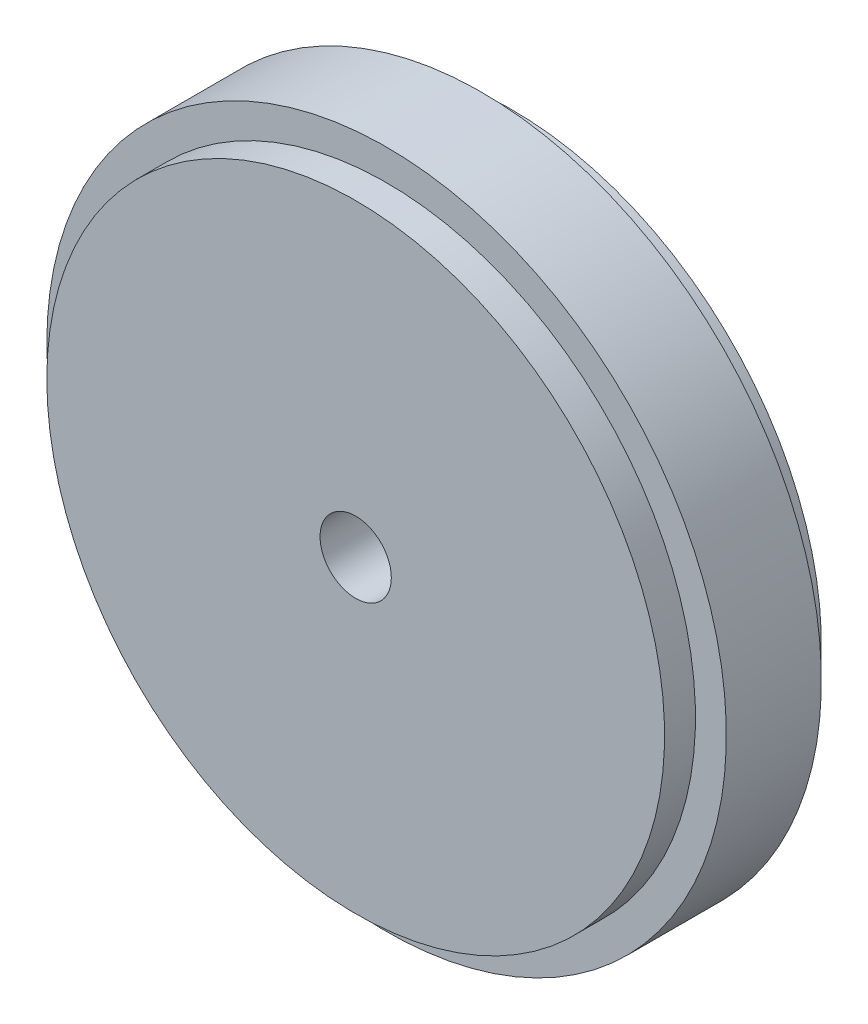
ISO-10303-21;
HEADER;
FILE_DESCRIPTION(('STEP AP214'),'2;1');
FILE_NAME('part.step','',(''),(''),'','','');
FILE_SCHEMA(('AUTOMOTIVE_DESIGN { 1 0 10303 214 1 1 1 1 }'));
ENDSEC;
DATA;
#1=APPLICATION_CONTEXT('core data for automotive mechanical design processes');
#2=APPLICATION_PROTOCOL_DEFINITION('international standard','automotive_design',2000,#1);
#3=PRODUCT_CONTEXT('',#1,'mechanical');
#4=PRODUCT('Part','Part','',(#3));
#5=PRODUCT_RELATED_PRODUCT_CATEGORY('part','',(#4));
#6=PRODUCT_DEFINITION_FORMATION('','',#4);
#7=PRODUCT_DEFINITION_CONTEXT('part definition',#1,'design');
#8=PRODUCT_DEFINITION('design','',#6,#7);
#9=PRODUCT_DEFINITION_SHAPE('','',#8);
#10=(LENGTH_UNIT() NAMED_UNIT(*) SI_UNIT(.MILLI.,.METRE.));
#11=(NAMED_UNIT(*) PLANE_ANGLE_UNIT() SI_UNIT($,.RADIAN.));
#12=(NAMED_UNIT(*) SI_UNIT($,.STERADIAN.) SOLID_ANGLE_UNIT());
#13=UNCERTAINTY_MEASURE_WITH_UNIT(LENGTH_MEASURE(1.E-05),#10,'distance_accuracy_value','');
#14=(GEOMETRIC_REPRESENTATION_CONTEXT(3) GLOBAL_UNCERTAINTY_ASSIGNED_CONTEXT((#13)) GLOBAL_UNIT_ASSIGNED_CONTEXT((#10,
#11,#12)) REPRESENTATION_CONTEXT('',''));
#15=CARTESIAN_POINT('',(0.,0.,0.));
#16=DIRECTION('',(0.,0.,1.));
#17=DIRECTION('',(1.,0.,0.));
#18=AXIS2_PLACEMENT_3D('',#15,#16,#17);
#19=CARTESIAN_POINT('',(0.,0.,-12.81771984393));
#20=DIRECTION('',(0.,0.,-1.));
#21=DIRECTION('',(-1.,0.,0.));
#22=AXIS2_PLACEMENT_3D('',#19,#20,#21);
#23=CYLINDRICAL_SURFACE('',#22,13.);
#24=CARTESIAN_POINT('',(0.,0.,-5.3));
#25=DIRECTION('',(0.,0.,-1.));
#26=DIRECTION('',(-1.,0.,0.));
#27=AXIS2_PLACEMENT_3D('',#24,#25,#26);
#28=CIRCLE('',#27,13.);
#29=CARTESIAN_POINT('',(-13.,0.,-5.3));
#30=VERTEX_POINT('',#29);
#31=EDGE_CURVE('E10',#30,#30,#28,.T.);
#32=ORIENTED_EDGE('',*,*,#31,.T.);
#33=EDGE_LOOP('',(#32));
#34=FACE_BOUND('',#33,.T.);
#35=CARTESIAN_POINT('',(0.,0.,-6.6));
#36=DIRECTION('',(0.,0.,-1.));
#37=DIRECTION('',(-1.,0.,0.));
#38=AXIS2_PLACEMENT_3D('',#35,#36,#37);
#39=CIRCLE('',#38,13.);
#40=CARTESIAN_POINT('',(-13.,0.,-6.6));
#41=VERTEX_POINT('',#40);
#42=EDGE_CURVE('E60',#41,#41,#39,.T.);
#43=ORIENTED_EDGE('',*,*,#42,.F.);
#44=EDGE_LOOP('',(#43));
#45=FACE_BOUND('',#44,.T.);
#46=ADVANCED_FACE('F32',(#34,#45),#23,.T.);
#47=CARTESIAN_POINT('',(0.,0.,-5.3));
#48=DIRECTION('',(0.,0.,-1.));
#49=DIRECTION('',(-1.,0.,0.));
#50=AXIS2_PLACEMENT_3D('',#47,#48,#49);
#51=PLANE('',#50);
#52=CARTESIAN_POINT('',(0.,0.,-5.3));
#53=DIRECTION('',(0.,0.,-1.));
#54=DIRECTION('',(-1.,0.,0.));
#55=AXIS2_PLACEMENT_3D('',#52,#53,#54);
#56=CIRCLE('',#55,14.3);
#57=CARTESIAN_POINT('',(-14.3,0.,-5.3));
#58=VERTEX_POINT('',#57);
#59=EDGE_CURVE('E38',#58,#58,#56,.T.);
#60=ORIENTED_EDGE('',*,*,#59,.T.);
#61=EDGE_LOOP('',(#60));
#62=FACE_BOUND('',#61,.T.);
#63=ORIENTED_EDGE('',*,*,#31,.F.);
#64=EDGE_LOOP('',(#63));
#65=FACE_BOUND('',#64,.T.);
#66=ADVANCED_FACE('F100',(#62,#65),#51,.T.);
#67=CARTESIAN_POINT('',(0.,0.,-12.81771984393));
#68=DIRECTION('',(0.,0.,-1.));
#69=DIRECTION('',(-1.,0.,0.));
#70=AXIS2_PLACEMENT_3D('',#67,#68,#69);
#71=CYLINDRICAL_SURFACE('',#70,14.3);
#72=ORIENTED_EDGE('',*,*,#59,.F.);
#73=EDGE_LOOP('',(#72));
#74=FACE_BOUND('',#73,.T.);
#75=CARTESIAN_POINT('',(0.,0.,-1.3));
#76=DIRECTION('',(0.,0.,-1.));
#77=DIRECTION('',(-1.,0.,0.));
#78=AXIS2_PLACEMENT_3D('',#75,#76,#77);
#79=CIRCLE('',#78,14.3);
#80=CARTESIAN_POINT('',(-14.3,0.,-1.3));
#81=VERTEX_POINT('',#80);
#82=EDGE_CURVE('E42',#81,#81,#79,.T.);
#83=ORIENTED_EDGE('',*,*,#82,.T.);
#84=EDGE_LOOP('',(#83));
#85=FACE_BOUND('',#84,.T.);
#86=ADVANCED_FACE('F94',(#74,#85),#71,.T.);
#87=CARTESIAN_POINT('',(0.,0.,-1.3));
#88=DIRECTION('',(0.,0.,-1.));
#89=DIRECTION('',(-1.,0.,0.));
#90=AXIS2_PLACEMENT_3D('',#87,#88,#89);
#91=PLANE('',#90);
#92=ORIENTED_EDGE('',*,*,#82,.F.);
#93=EDGE_LOOP('',(#92));
#94=FACE_BOUND('',#93,.T.);
#95=CARTESIAN_POINT('',(0.,0.,-1.3));
#96=DIRECTION('',(0.,0.,-1.));
#97=DIRECTION('',(-1.,0.,0.));
#98=AXIS2_PLACEMENT_3D('',#95,#96,#97);
#99=CIRCLE('',#98,13.);
#100=CARTESIAN_POINT('',(-13.,0.,-1.3));
#101=VERTEX_POINT('',#100);
#102=EDGE_CURVE('E46',#101,#101,#99,.T.);
#103=ORIENTED_EDGE('',*,*,#102,.T.);
#104=EDGE_LOOP('',(#103));
#105=FACE_BOUND('',#104,.T.);
#106=ADVANCED_FACE('F89',(#94,#105),#91,.F.);
#107=CARTESIAN_POINT('',(0.,0.,-12.81771984393));
#108=DIRECTION('',(0.,0.,-1.));
#109=DIRECTION('',(-1.,0.,0.));
#110=AXIS2_PLACEMENT_3D('',#107,#108,#109);
#111=CYLINDRICAL_SURFACE('',#110,13.);
#112=CARTESIAN_POINT('',(0.,0.,0.));
#113=DIRECTION('',(0.,0.,-1.));
#114=DIRECTION('',(-1.,0.,0.));
#115=AXIS2_PLACEMENT_3D('',#112,#113,#114);
#116=CIRCLE('',#115,13.);
#117=CARTESIAN_POINT('',(-13.,0.,0.));
#118=VERTEX_POINT('',#117);
#119=EDGE_CURVE('E51',#118,#118,#116,.T.);
#120=ORIENTED_EDGE('',*,*,#119,.T.);
#121=EDGE_LOOP('',(#120));
#122=FACE_BOUND('',#121,.T.);
#123=ORIENTED_EDGE('',*,*,#102,.F.);
#124=EDGE_LOOP('',(#123));
#125=FACE_BOUND('',#124,.T.);
#126=ADVANCED_FACE('F83',(#122,#125),#111,.T.);
#127=CARTESIAN_POINT('',(0.,0.,0.));
#128=DIRECTION('',(0.,0.,-1.));
#129=DIRECTION('',(-1.,0.,0.));
#130=AXIS2_PLACEMENT_3D('',#127,#128,#129);
#131=PLANE('',#130);
#132=CARTESIAN_POINT('',(0.,0.,0.));
#133=DIRECTION('',(0.,0.,1.));
#134=DIRECTION('',(1.,0.,0.));
#135=AXIS2_PLACEMENT_3D('',#132,#133,#134);
#136=CIRCLE('',#135,1.5);
#137=CARTESIAN_POINT('',(1.5,0.,0.));
#138=VERTEX_POINT('',#137);
#139=EDGE_CURVE('E64',#138,#138,#136,.T.);
#140=ORIENTED_EDGE('',*,*,#139,.F.);
#141=EDGE_LOOP('',(#140));
#142=FACE_BOUND('',#141,.T.);
#143=ORIENTED_EDGE('',*,*,#119,.F.);
#144=EDGE_LOOP('',(#143));
#145=FACE_BOUND('',#144,.T.);
#146=ADVANCED_FACE('F80',(#142,#145),#131,.F.);
#147=CARTESIAN_POINT('',(0.,0.,-8.6));
#148=DIRECTION('',(0.,0.,-1.));
#149=DIRECTION('',(-1.,0.,0.));
#150=AXIS2_PLACEMENT_3D('',#147,#148,#149);
#151=PLANE('',#150);
#152=CARTESIAN_POINT('',(0.,0.,-8.6));
#153=DIRECTION('',(0.,0.,1.));
#154=DIRECTION('',(1.,0.,0.));
#155=AXIS2_PLACEMENT_3D('',#152,#153,#154);
#156=CIRCLE('',#155,1.5);
#157=CARTESIAN_POINT('',(1.5,0.,-8.6));
#158=VERTEX_POINT('',#157);
#159=EDGE_CURVE('E63',#158,#158,#156,.T.);
#160=ORIENTED_EDGE('',*,*,#159,.T.);
#161=EDGE_LOOP('',(#160));
#162=FACE_BOUND('',#161,.T.);
#163=CARTESIAN_POINT('',(0.,0.,-8.6));
#164=DIRECTION('',(0.,0.,-1.));
#165=DIRECTION('',(-1.,0.,0.));
#166=AXIS2_PLACEMENT_3D('',#163,#164,#165);
#167=CIRCLE('',#166,3.5);
#168=CARTESIAN_POINT('',(-3.5,0.,-8.6));
#169=VERTEX_POINT('',#168);
#170=EDGE_CURVE('E54',#169,#169,#167,.T.);
#171=ORIENTED_EDGE('',*,*,#170,.T.);
#172=EDGE_LOOP('',(#171));
#173=FACE_BOUND('',#172,.T.);
#174=ADVANCED_FACE('F70',(#162,#173),#151,.T.);
#175=CARTESIAN_POINT('',(0.,0.,-12.81771984393));
#176=DIRECTION('',(0.,0.,-1.));
#177=DIRECTION('',(-1.,0.,0.));
#178=AXIS2_PLACEMENT_3D('',#175,#176,#177);
#179=CYLINDRICAL_SURFACE('',#178,3.5);
#180=ORIENTED_EDGE('',*,*,#170,.F.);
#181=EDGE_LOOP('',(#180));
#182=FACE_BOUND('',#181,.T.);
#183=CARTESIAN_POINT('',(0.,0.,-6.6));
#184=DIRECTION('',(0.,0.,-1.));
#185=DIRECTION('',(-1.,0.,0.));
#186=AXIS2_PLACEMENT_3D('',#183,#184,#185);
#187=CIRCLE('',#186,3.5);
#188=CARTESIAN_POINT('',(-3.5,0.,-6.6));
#189=VERTEX_POINT('',#188);
#190=EDGE_CURVE('E57',#189,#189,#187,.T.);
#191=ORIENTED_EDGE('',*,*,#190,.T.);
#192=EDGE_LOOP('',(#191));
#193=FACE_BOUND('',#192,.T.);
#194=ADVANCED_FACE('F113',(#182,#193),#179,.T.);
#195=CARTESIAN_POINT('',(0.,0.,-6.6));
#196=DIRECTION('',(0.,0.,-1.));
#197=DIRECTION('',(-1.,0.,0.));
#198=AXIS2_PLACEMENT_3D('',#195,#196,#197);
#199=PLANE('',#198);
#200=ORIENTED_EDGE('',*,*,#42,.T.);
#201=EDGE_LOOP('',(#200));
#202=FACE_BOUND('',#201,.T.);
#203=ORIENTED_EDGE('',*,*,#190,.F.);
#204=EDGE_LOOP('',(#203));
#205=FACE_BOUND('',#204,.T.);
#206=ADVANCED_FACE('F76',(#202,#205),#199,.T.);
#207=CARTESIAN_POINT('',(0.,0.,-8.6));
#208=DIRECTION('',(0.,0.,1.));
#209=DIRECTION('',(1.,0.,0.));
#210=AXIS2_PLACEMENT_3D('',#207,#208,#209);
#211=CYLINDRICAL_SURFACE('',#210,1.5);
#212=CARTESIAN_POINT('',(1.5,0.,-8.6));
#213=CARTESIAN_POINT('',(1.5,0.,-8.51041666666667));
#214=CARTESIAN_POINT('',(1.5,0.,-8.42083333333333));
#215=CARTESIAN_POINT('',(1.5,0.,-8.24166666666667));
#216=CARTESIAN_POINT('',(1.5,0.,-8.15208333333333));
#217=CARTESIAN_POINT('',(1.5,0.,-7.97291666666667));
#218=CARTESIAN_POINT('',(1.5,0.,-7.88333333333333));
#219=CARTESIAN_POINT('',(1.5,0.,-7.70416666666667));
#220=CARTESIAN_POINT('',(1.5,0.,-7.61458333333333));
#221=CARTESIAN_POINT('',(1.5,0.,-7.43541666666667));
#222=CARTESIAN_POINT('',(1.5,0.,-7.34583333333333));
#223=CARTESIAN_POINT('',(1.5,0.,-7.16666666666667));
#224=CARTESIAN_POINT('',(1.5,0.,-7.07708333333333));
#225=CARTESIAN_POINT('',(1.5,0.,-6.89791666666667));
#226=CARTESIAN_POINT('',(1.5,0.,-6.80833333333333));
#227=CARTESIAN_POINT('',(1.5,0.,-6.62916666666667));
#228=CARTESIAN_POINT('',(1.5,0.,-6.53958333333333));
#229=CARTESIAN_POINT('',(1.5,0.,-6.36041666666667));
#230=CARTESIAN_POINT('',(1.5,0.,-6.27083333333333));
#231=CARTESIAN_POINT('',(1.5,0.,-6.09166666666667));
#232=CARTESIAN_POINT('',(1.5,0.,-6.00208333333333));
#233=CARTESIAN_POINT('',(1.5,0.,-5.82291666666667));
#234=CARTESIAN_POINT('',(1.5,0.,-5.73333333333333));
#235=CARTESIAN_POINT('',(1.5,0.,-5.55416666666667));
#236=CARTESIAN_POINT('',(1.5,0.,-5.46458333333333));
#237=CARTESIAN_POINT('',(1.5,0.,-5.28541666666667));
#238=CARTESIAN_POINT('',(1.5,0.,-5.19583333333333));
#239=CARTESIAN_POINT('',(1.5,0.,-5.01666666666667));
#240=CARTESIAN_POINT('',(1.5,0.,-4.92708333333333));
#241=CARTESIAN_POINT('',(1.5,0.,-4.74791666666667));
#242=CARTESIAN_POINT('',(1.5,0.,-4.65833333333333));
#243=CARTESIAN_POINT('',(1.5,0.,-4.47916666666667));
#244=CARTESIAN_POINT('',(1.5,0.,-4.38958333333334));
#245=CARTESIAN_POINT('',(1.5,0.,-4.21041666666667));
#246=CARTESIAN_POINT('',(1.5,0.,-4.12083333333333));
#247=CARTESIAN_POINT('',(1.5,0.,-3.94166666666667));
#248=CARTESIAN_POINT('',(1.5,0.,-3.85208333333334));
#249=CARTESIAN_POINT('',(1.5,0.,-3.67291666666667));
#250=CARTESIAN_POINT('',(1.5,0.,-3.58333333333334));
#251=CARTESIAN_POINT('',(1.5,0.,-3.40416666666667));
#252=CARTESIAN_POINT('',(1.5,0.,-3.31458333333334));
#253=CARTESIAN_POINT('',(1.5,0.,-3.13541666666667));
#254=CARTESIAN_POINT('',(1.5,0.,-3.04583333333333));
#255=CARTESIAN_POINT('',(1.5,0.,-2.86666666666667));
#256=CARTESIAN_POINT('',(1.5,0.,-2.77708333333333));
#257=CARTESIAN_POINT('',(1.5,0.,-2.59791666666667));
#258=CARTESIAN_POINT('',(1.5,0.,-2.50833333333334));
#259=CARTESIAN_POINT('',(1.5,0.,-2.32916666666667));
#260=CARTESIAN_POINT('',(1.5,0.,-2.23958333333334));
#261=CARTESIAN_POINT('',(1.5,0.,-2.06041666666667));
#262=CARTESIAN_POINT('',(1.5,0.,-1.97083333333334));
#263=CARTESIAN_POINT('',(1.5,0.,-1.79166666666667));
#264=CARTESIAN_POINT('',(1.5,0.,-1.70208333333334));
#265=CARTESIAN_POINT('',(1.5,0.,-1.52291666666667));
#266=CARTESIAN_POINT('',(1.5,0.,-1.43333333333334));
#267=CARTESIAN_POINT('',(1.5,0.,-1.25416666666667));
#268=CARTESIAN_POINT('',(1.5,0.,-1.16458333333333));
#269=CARTESIAN_POINT('',(1.5,0.,-0.985416666666668));
#270=CARTESIAN_POINT('',(1.5,0.,-0.895833333333335));
#271=CARTESIAN_POINT('',(1.5,0.,-0.716666666666668));
#272=CARTESIAN_POINT('',(1.5,0.,-0.627083333333335));
#273=CARTESIAN_POINT('',(1.5,0.,-0.447916666666668));
#274=CARTESIAN_POINT('',(1.5,0.,-0.358333333333335));
#275=CARTESIAN_POINT('',(1.5,0.,-0.179166666666668));
#276=CARTESIAN_POINT('',(1.5,0.,-0.0895833333333351));
#277=CARTESIAN_POINT('',(1.5,0.,0.));
#278=B_SPLINE_CURVE_WITH_KNOTS('',3,(#212,#213,#214,#215,#216,#217,#218,#219,#220,#221,#222,
#223,#224,#225,#226,#227,#228,#229,#230,#231,#232,#233,#234,#235,#236,#237,#238,#239,#240,#241,
#242,#243,#244,#245,#246,#247,#248,#249,#250,#251,#252,#253,#254,#255,#256,#257,#258,#259,#260,
#261,#262,#263,#264,#265,#266,#267,#268,#269,#270,#271,#272,#273,#274,#275,#276,#277),
.UNSPECIFIED.,.F.,.F.,(4,2,2,2,2,2,2,2,2,2,2,2,2,2,2,2,2,2,2,2,2,2,2,2,2,2,2,2,2,2,2,2,4),(0.,
0.26875,0.5375,0.806249999999999,1.075,1.34375,1.6125,1.88125,2.15,2.41875,2.6875,2.95625,3.225,
3.49375,3.7625,4.03125,4.3,4.56875,4.8375,5.10625,5.375,5.64375,5.9125,6.18125,6.45,6.71875,
6.9875,7.25625,7.525,7.79375,8.0625,8.33125,8.6),.UNSPECIFIED.);
#279=EDGE_CURVE('BSEAM73',#158,#138,#278,.T.);
#280=ORIENTED_EDGE('',*,*,#159,.F.);
#281=ORIENTED_EDGE('',*,*,#139,.T.);
#282=ORIENTED_EDGE('',*,*,#279,.T.);
#283=ORIENTED_EDGE('',*,*,#279,.F.);
#284=EDGE_LOOP('',(#280,#282,#281,#283));
#285=FACE_BOUND('',#284,.T.);
#286=ADVANCED_FACE('F73',(#285),#211,.F.);
#287=CLOSED_SHELL('',(#46,#66,#86,#106,#126,#146,#174,#194,#206,#286));
#288=MANIFOLD_SOLID_BREP('B2',#287);
#289=ADVANCED_BREP_SHAPE_REPRESENTATION('',(#18,#288),#14);
#290=SHAPE_DEFINITION_REPRESENTATION(#9,#289);
ENDSEC;
END-ISO-10303-21;
